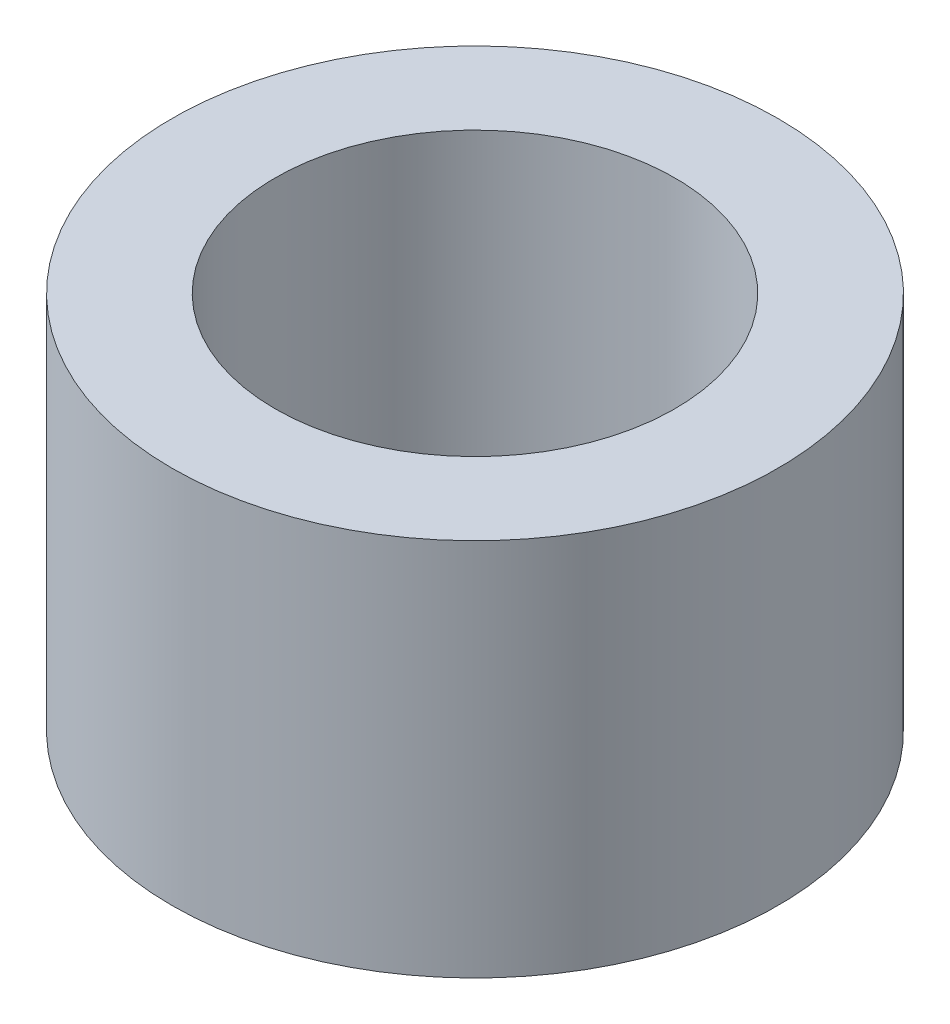
ISO-10303-21;
HEADER;
FILE_DESCRIPTION(('STEP AP214'),'2;1');
FILE_NAME('part.step','',(''),(''),'','','');
FILE_SCHEMA(('AUTOMOTIVE_DESIGN { 1 0 10303 214 1 1 1 1 }'));
ENDSEC;
DATA;
#1=APPLICATION_CONTEXT('core data for automotive mechanical design processes');
#2=APPLICATION_PROTOCOL_DEFINITION('international standard','automotive_design',2000,#1);
#3=PRODUCT_CONTEXT('',#1,'mechanical');
#4=PRODUCT('Part','Part','',(#3));
#5=PRODUCT_RELATED_PRODUCT_CATEGORY('part','',(#4));
#6=PRODUCT_DEFINITION_FORMATION('','',#4);
#7=PRODUCT_DEFINITION_CONTEXT('part definition',#1,'design');
#8=PRODUCT_DEFINITION('design','',#6,#7);
#9=PRODUCT_DEFINITION_SHAPE('','',#8);
#10=(LENGTH_UNIT() NAMED_UNIT(*) SI_UNIT(.MILLI.,.METRE.));
#11=(NAMED_UNIT(*) PLANE_ANGLE_UNIT() SI_UNIT($,.RADIAN.));
#12=(NAMED_UNIT(*) SI_UNIT($,.STERADIAN.) SOLID_ANGLE_UNIT());
#13=UNCERTAINTY_MEASURE_WITH_UNIT(LENGTH_MEASURE(1.E-05),#10,'distance_accuracy_value','');
#14=(GEOMETRIC_REPRESENTATION_CONTEXT(3) GLOBAL_UNCERTAINTY_ASSIGNED_CONTEXT((#13)) GLOBAL_UNIT_ASSIGNED_CONTEXT((#10,
#11,#12)) REPRESENTATION_CONTEXT('',''));
#15=CARTESIAN_POINT('',(0.,0.,0.));
#16=DIRECTION('',(0.,0.,1.));
#17=DIRECTION('',(1.,0.,0.));
#18=AXIS2_PLACEMENT_3D('',#15,#16,#17);
#19=CARTESIAN_POINT('',(0.,15.875,0.));
#20=DIRECTION('',(0.,1.,0.));
#21=DIRECTION('',(0.,0.,1.));
#22=AXIS2_PLACEMENT_3D('',#19,#20,#21);
#23=PLANE('',#22);
#24=CARTESIAN_POINT('',(0.,15.875,0.));
#25=DIRECTION('',(0.,1.,0.));
#26=DIRECTION('',(0.,0.,1.));
#27=AXIS2_PLACEMENT_3D('',#24,#25,#26);
#28=CIRCLE('',#27,12.7);
#29=CARTESIAN_POINT('',(0.,15.875,12.7));
#30=VERTEX_POINT('',#29);
#31=EDGE_CURVE('E10',#30,#30,#28,.T.);
#32=ORIENTED_EDGE('',*,*,#31,.T.);
#33=EDGE_LOOP('',(#32));
#34=FACE_BOUND('',#33,.T.);
#35=CARTESIAN_POINT('',(0.,15.875,0.));
#36=DIRECTION('',(0.,1.,0.));
#37=DIRECTION('',(0.,0.,1.));
#38=AXIS2_PLACEMENT_3D('',#35,#36,#37);
#39=CIRCLE('',#38,8.382);
#40=CARTESIAN_POINT('',(0.,15.875,8.382));
#41=VERTEX_POINT('',#40);
#42=EDGE_CURVE('E50',#41,#41,#39,.T.);
#43=ORIENTED_EDGE('',*,*,#42,.F.);
#44=EDGE_LOOP('',(#43));
#45=FACE_BOUND('',#44,.T.);
#46=ADVANCED_FACE('F37',(#34,#45),#23,.T.);
#47=CARTESIAN_POINT('',(0.,0.,0.));
#48=DIRECTION('',(0.,1.,0.));
#49=DIRECTION('',(0.,0.,1.));
#50=AXIS2_PLACEMENT_3D('',#47,#48,#49);
#51=PLANE('',#50);
#52=CARTESIAN_POINT('',(0.,0.,0.));
#53=DIRECTION('',(0.,1.,0.));
#54=DIRECTION('',(0.,0.,1.));
#55=AXIS2_PLACEMENT_3D('',#52,#53,#54);
#56=CIRCLE('',#55,12.7);
#57=CARTESIAN_POINT('',(0.,0.,12.7));
#58=VERTEX_POINT('',#57);
#59=EDGE_CURVE('E41',#58,#58,#56,.T.);
#60=ORIENTED_EDGE('',*,*,#59,.F.);
#61=EDGE_LOOP('',(#60));
#62=FACE_BOUND('',#61,.T.);
#63=CARTESIAN_POINT('',(0.,0.,0.));
#64=DIRECTION('',(0.,1.,0.));
#65=DIRECTION('',(0.,0.,1.));
#66=AXIS2_PLACEMENT_3D('',#63,#64,#65);
#67=CIRCLE('',#66,8.382);
#68=CARTESIAN_POINT('',(0.,0.,8.382));
#69=VERTEX_POINT('',#68);
#70=EDGE_CURVE('E52',#69,#69,#67,.T.);
#71=ORIENTED_EDGE('',*,*,#70,.T.);
#72=EDGE_LOOP('',(#71));
#73=FACE_BOUND('',#72,.T.);
#74=ADVANCED_FACE('F64',(#62,#73),#51,.F.);
#75=CARTESIAN_POINT('',(0.,15.875,0.));
#76=DIRECTION('',(0.,-1.,0.));
#77=DIRECTION('',(0.,0.,-1.));
#78=AXIS2_PLACEMENT_3D('',#75,#76,#77);
#79=CYLINDRICAL_SURFACE('',#78,12.7);
#80=ORIENTED_EDGE('',*,*,#31,.F.);
#81=EDGE_LOOP('',(#80));
#82=FACE_BOUND('',#81,.T.);
#83=ORIENTED_EDGE('',*,*,#59,.T.);
#84=EDGE_LOOP('',(#83));
#85=FACE_BOUND('',#84,.T.);
#86=ADVANCED_FACE('F39',(#82,#85),#79,.T.);
#87=CARTESIAN_POINT('',(0.,15.875,0.));
#88=DIRECTION('',(0.,-1.,0.));
#89=DIRECTION('',(0.,0.,-1.));
#90=AXIS2_PLACEMENT_3D('',#87,#88,#89);
#91=CYLINDRICAL_SURFACE('',#90,8.382);
#92=ORIENTED_EDGE('',*,*,#42,.T.);
#93=EDGE_LOOP('',(#92));
#94=FACE_BOUND('',#93,.T.);
#95=ORIENTED_EDGE('',*,*,#70,.F.);
#96=EDGE_LOOP('',(#95));
#97=FACE_BOUND('',#96,.T.);
#98=ADVANCED_FACE('F60',(#94,#97),#91,.F.);
#99=CLOSED_SHELL('',(#46,#74,#86,#98));
#100=MANIFOLD_SOLID_BREP('B2',#99);
#101=ADVANCED_BREP_SHAPE_REPRESENTATION('',(#18,#100),#14);
#102=SHAPE_DEFINITION_REPRESENTATION(#9,#101);
ENDSEC;
END-ISO-10303-21;
